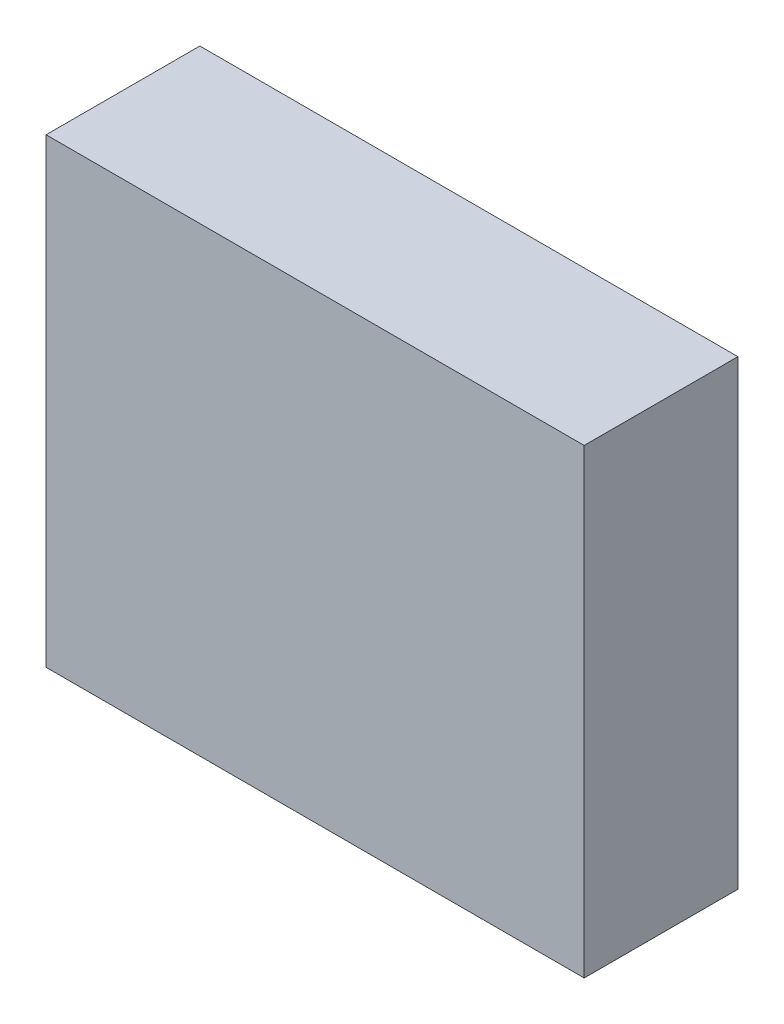
ISO-10303-21;
HEADER;
FILE_DESCRIPTION(('STEP AP214'),'2;1');
FILE_NAME('part.step','',(''),(''),'','','');
FILE_SCHEMA(('AUTOMOTIVE_DESIGN { 1 0 10303 214 1 1 1 1 }'));
ENDSEC;
DATA;
#1=APPLICATION_CONTEXT('core data for automotive mechanical design processes');
#2=APPLICATION_PROTOCOL_DEFINITION('international standard','automotive_design',2000,#1);
#3=PRODUCT_CONTEXT('',#1,'mechanical');
#4=PRODUCT('Part','Part','',(#3));
#5=PRODUCT_RELATED_PRODUCT_CATEGORY('part','',(#4));
#6=PRODUCT_DEFINITION_FORMATION('','',#4);
#7=PRODUCT_DEFINITION_CONTEXT('part definition',#1,'design');
#8=PRODUCT_DEFINITION('design','',#6,#7);
#9=PRODUCT_DEFINITION_SHAPE('','',#8);
#10=(LENGTH_UNIT() NAMED_UNIT(*) SI_UNIT(.MILLI.,.METRE.));
#11=(NAMED_UNIT(*) PLANE_ANGLE_UNIT() SI_UNIT($,.RADIAN.));
#12=(NAMED_UNIT(*) SI_UNIT($,.STERADIAN.) SOLID_ANGLE_UNIT());
#13=UNCERTAINTY_MEASURE_WITH_UNIT(LENGTH_MEASURE(1.E-05),#10,'distance_accuracy_value','');
#14=(GEOMETRIC_REPRESENTATION_CONTEXT(3) GLOBAL_UNCERTAINTY_ASSIGNED_CONTEXT((#13)) GLOBAL_UNIT_ASSIGNED_CONTEXT((#10,
#11,#12)) REPRESENTATION_CONTEXT('',''));
#15=CARTESIAN_POINT('',(0.,0.,0.));
#16=DIRECTION('',(0.,0.,1.));
#17=DIRECTION('',(1.,0.,0.));
#18=AXIS2_PLACEMENT_3D('',#15,#16,#17);
#19=CARTESIAN_POINT('',(35.,-30.,20.));
#20=DIRECTION('',(-1.,0.,0.));
#21=DIRECTION('',(0.,0.,1.));
#22=AXIS2_PLACEMENT_3D('',#19,#20,#21);
#23=PLANE('',#22);
#24=DIRECTION('',(0.,1.,0.));
#25=VECTOR('',#24,1.);
#26=CARTESIAN_POINT('',(35.,-30.,0.));
#27=LINE('',#26,#25);
#28=CARTESIAN_POINT('',(35.,-30.,0.));
#29=VERTEX_POINT('',#28);
#30=CARTESIAN_POINT('',(35.,30.,0.));
#31=VERTEX_POINT('',#30);
#32=EDGE_CURVE('E113',#29,#31,#27,.T.);
#33=ORIENTED_EDGE('',*,*,#32,.T.);
#34=DIRECTION('',(0.,0.,-1.));
#35=VECTOR('',#34,1.);
#36=CARTESIAN_POINT('',(35.,30.,20.));
#37=LINE('',#36,#35);
#38=CARTESIAN_POINT('',(35.,30.,20.));
#39=VERTEX_POINT('',#38);
#40=EDGE_CURVE('E11',#39,#31,#37,.T.);
#41=ORIENTED_EDGE('',*,*,#40,.F.);
#42=DIRECTION('',(0.,1.,0.));
#43=VECTOR('',#42,1.);
#44=CARTESIAN_POINT('',(35.,-30.,20.));
#45=LINE('',#44,#43);
#46=CARTESIAN_POINT('',(35.,-30.,20.));
#47=VERTEX_POINT('',#46);
#48=EDGE_CURVE('E97',#47,#39,#45,.T.);
#49=ORIENTED_EDGE('',*,*,#48,.F.);
#50=DIRECTION('',(0.,0.,-1.));
#51=VECTOR('',#50,1.);
#52=CARTESIAN_POINT('',(35.,-30.,20.));
#53=LINE('',#52,#51);
#54=EDGE_CURVE('E109',#47,#29,#53,.T.);
#55=ORIENTED_EDGE('',*,*,#54,.T.);
#56=EDGE_LOOP('',(#33,#41,#49,#55));
#57=FACE_BOUND('',#56,.T.);
#58=ADVANCED_FACE('F45',(#57),#23,.F.);
#59=CARTESIAN_POINT('',(-35.,30.,20.));
#60=DIRECTION('',(0.,-1.,0.));
#61=DIRECTION('',(0.,0.,-1.));
#62=AXIS2_PLACEMENT_3D('',#59,#60,#61);
#63=PLANE('',#62);
#64=DIRECTION('',(-1.,0.,0.));
#65=VECTOR('',#64,1.);
#66=CARTESIAN_POINT('',(-35.,30.,0.));
#67=LINE('',#66,#65);
#68=CARTESIAN_POINT('',(-35.,30.,0.));
#69=VERTEX_POINT('',#68);
#70=EDGE_CURVE('E102',#31,#69,#67,.T.);
#71=ORIENTED_EDGE('',*,*,#70,.T.);
#72=DIRECTION('',(0.,0.,-1.));
#73=VECTOR('',#72,1.);
#74=CARTESIAN_POINT('',(-35.,30.,20.));
#75=LINE('',#74,#73);
#76=CARTESIAN_POINT('',(-35.,30.,20.));
#77=VERTEX_POINT('',#76);
#78=EDGE_CURVE('E54',#77,#69,#75,.T.);
#79=ORIENTED_EDGE('',*,*,#78,.F.);
#80=DIRECTION('',(-1.,0.,0.));
#81=VECTOR('',#80,1.);
#82=CARTESIAN_POINT('',(-35.,30.,20.));
#83=LINE('',#82,#81);
#84=EDGE_CURVE('E92',#39,#77,#83,.T.);
#85=ORIENTED_EDGE('',*,*,#84,.F.);
#86=ORIENTED_EDGE('',*,*,#40,.T.);
#87=EDGE_LOOP('',(#71,#79,#85,#86));
#88=FACE_BOUND('',#87,.T.);
#89=ADVANCED_FACE('F101',(#88),#63,.F.);
#90=CARTESIAN_POINT('',(-35.,-30.,20.));
#91=DIRECTION('',(1.,0.,0.));
#92=DIRECTION('',(0.,0.,-1.));
#93=AXIS2_PLACEMENT_3D('',#90,#91,#92);
#94=PLANE('',#93);
#95=DIRECTION('',(0.,-1.,0.));
#96=VECTOR('',#95,1.);
#97=CARTESIAN_POINT('',(-35.,-30.,0.));
#98=LINE('',#97,#96);
#99=CARTESIAN_POINT('',(-35.,-30.,0.));
#100=VERTEX_POINT('',#99);
#101=EDGE_CURVE('E79',#69,#100,#98,.T.);
#102=ORIENTED_EDGE('',*,*,#101,.T.);
#103=DIRECTION('',(0.,0.,-1.));
#104=VECTOR('',#103,1.);
#105=CARTESIAN_POINT('',(-35.,-30.,20.));
#106=LINE('',#105,#104);
#107=CARTESIAN_POINT('',(-35.,-30.,20.));
#108=VERTEX_POINT('',#107);
#109=EDGE_CURVE('E104',#108,#100,#106,.T.);
#110=ORIENTED_EDGE('',*,*,#109,.F.);
#111=DIRECTION('',(0.,-1.,0.));
#112=VECTOR('',#111,1.);
#113=CARTESIAN_POINT('',(-35.,-30.,20.));
#114=LINE('',#113,#112);
#115=EDGE_CURVE('E95',#77,#108,#114,.T.);
#116=ORIENTED_EDGE('',*,*,#115,.F.);
#117=ORIENTED_EDGE('',*,*,#78,.T.);
#118=EDGE_LOOP('',(#102,#110,#116,#117));
#119=FACE_BOUND('',#118,.T.);
#120=ADVANCED_FACE('F105',(#119),#94,.F.);
#121=CARTESIAN_POINT('',(-35.,-30.,20.));
#122=DIRECTION('',(0.,1.,0.));
#123=DIRECTION('',(0.,0.,1.));
#124=AXIS2_PLACEMENT_3D('',#121,#122,#123);
#125=PLANE('',#124);
#126=DIRECTION('',(1.,0.,0.));
#127=VECTOR('',#126,1.);
#128=CARTESIAN_POINT('',(-35.,-30.,0.));
#129=LINE('',#128,#127);
#130=EDGE_CURVE('E85',#100,#29,#129,.T.);
#131=ORIENTED_EDGE('',*,*,#130,.T.);
#132=ORIENTED_EDGE('',*,*,#54,.F.);
#133=DIRECTION('',(1.,0.,0.));
#134=VECTOR('',#133,1.);
#135=CARTESIAN_POINT('',(-35.,-30.,20.));
#136=LINE('',#135,#134);
#137=EDGE_CURVE('E62',#108,#47,#136,.T.);
#138=ORIENTED_EDGE('',*,*,#137,.F.);
#139=ORIENTED_EDGE('',*,*,#109,.T.);
#140=EDGE_LOOP('',(#131,#132,#138,#139));
#141=FACE_BOUND('',#140,.T.);
#142=ADVANCED_FACE('F126',(#141),#125,.F.);
#143=CARTESIAN_POINT('',(0.,0.,20.));
#144=DIRECTION('',(0.,0.,-1.));
#145=DIRECTION('',(-1.,0.,0.));
#146=AXIS2_PLACEMENT_3D('',#143,#144,#145);
#147=PLANE('',#146);
#148=ORIENTED_EDGE('',*,*,#48,.T.);
#149=ORIENTED_EDGE('',*,*,#84,.T.);
#150=ORIENTED_EDGE('',*,*,#115,.T.);
#151=ORIENTED_EDGE('',*,*,#137,.T.);
#152=EDGE_LOOP('',(#148,#149,#150,#151));
#153=FACE_BOUND('',#152,.T.);
#154=ADVANCED_FACE('F93',(#153),#147,.F.);
#155=CARTESIAN_POINT('',(0.,0.,0.));
#156=DIRECTION('',(0.,0.,-1.));
#157=DIRECTION('',(-1.,0.,0.));
#158=AXIS2_PLACEMENT_3D('',#155,#156,#157);
#159=PLANE('',#158);
#160=ORIENTED_EDGE('',*,*,#32,.F.);
#161=ORIENTED_EDGE('',*,*,#130,.F.);
#162=ORIENTED_EDGE('',*,*,#101,.F.);
#163=ORIENTED_EDGE('',*,*,#70,.F.);
#164=EDGE_LOOP('',(#160,#161,#162,#163));
#165=FACE_BOUND('',#164,.T.);
#166=ADVANCED_FACE('F129',(#165),#159,.T.);
#167=CLOSED_SHELL('',(#58,#89,#120,#142,#154,#166));
#168=MANIFOLD_SOLID_BREP('B2',#167);
#169=ADVANCED_BREP_SHAPE_REPRESENTATION('',(#18,#168),#14);
#170=SHAPE_DEFINITION_REPRESENTATION(#9,#169);
ENDSEC;
END-ISO-10303-21;
